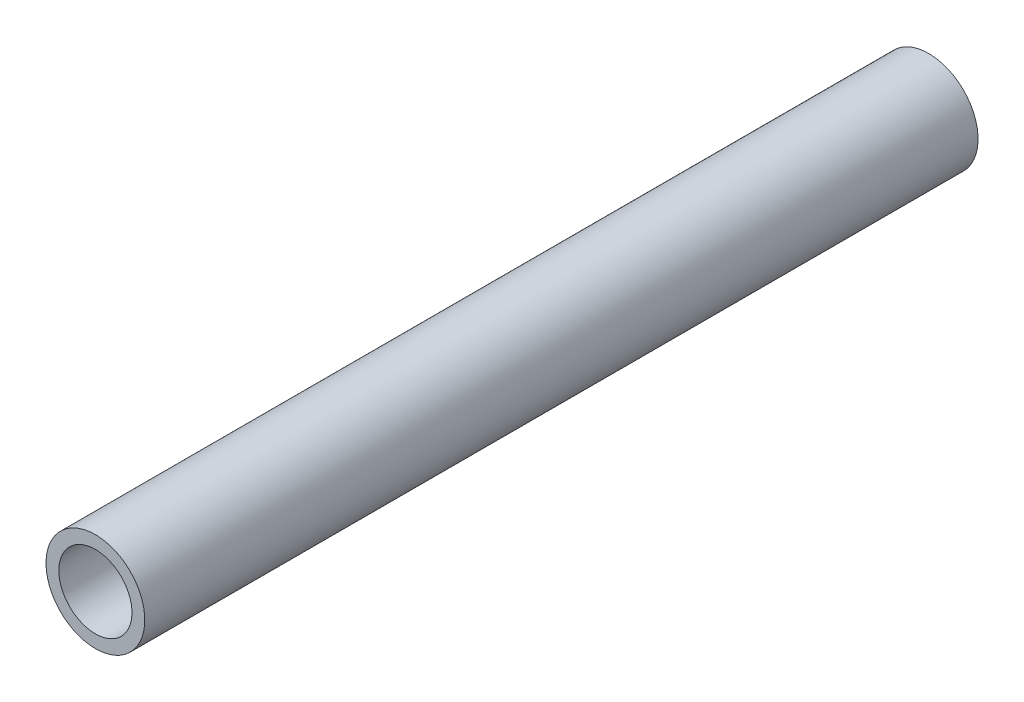
ISO-10303-21;
HEADER;
FILE_DESCRIPTION(('STEP AP214'),'2;1');
FILE_NAME('part.step','',(''),(''),'','','');
FILE_SCHEMA(('AUTOMOTIVE_DESIGN { 1 0 10303 214 1 1 1 1 }'));
ENDSEC;
DATA;
#1=APPLICATION_CONTEXT('core data for automotive mechanical design processes');
#2=APPLICATION_PROTOCOL_DEFINITION('international standard','automotive_design',2000,#1);
#3=PRODUCT_CONTEXT('',#1,'mechanical');
#4=PRODUCT('Part','Part','',(#3));
#5=PRODUCT_RELATED_PRODUCT_CATEGORY('part','',(#4));
#6=PRODUCT_DEFINITION_FORMATION('','',#4);
#7=PRODUCT_DEFINITION_CONTEXT('part definition',#1,'design');
#8=PRODUCT_DEFINITION('design','',#6,#7);
#9=PRODUCT_DEFINITION_SHAPE('','',#8);
#10=(LENGTH_UNIT() NAMED_UNIT(*) SI_UNIT(.MILLI.,.METRE.));
#11=(NAMED_UNIT(*) PLANE_ANGLE_UNIT() SI_UNIT($,.RADIAN.));
#12=(NAMED_UNIT(*) SI_UNIT($,.STERADIAN.) SOLID_ANGLE_UNIT());
#13=UNCERTAINTY_MEASURE_WITH_UNIT(LENGTH_MEASURE(1.E-05),#10,'distance_accuracy_value','');
#14=(GEOMETRIC_REPRESENTATION_CONTEXT(3) GLOBAL_UNCERTAINTY_ASSIGNED_CONTEXT((#13)) GLOBAL_UNIT_ASSIGNED_CONTEXT((#10,
#11,#12)) REPRESENTATION_CONTEXT('',''));
#15=CARTESIAN_POINT('',(0.,0.,0.));
#16=DIRECTION('',(0.,0.,1.));
#17=DIRECTION('',(1.,0.,0.));
#18=AXIS2_PLACEMENT_3D('',#15,#16,#17);
#19=CARTESIAN_POINT('',(0.,0.,90.));
#20=DIRECTION('',(0.,0.,1.));
#21=DIRECTION('',(1.,0.,0.));
#22=AXIS2_PLACEMENT_3D('',#19,#20,#21);
#23=PLANE('',#22);
#24=CARTESIAN_POINT('',(0.,0.,90.));
#25=DIRECTION('',(0.,0.,1.));
#26=DIRECTION('',(1.,0.,0.));
#27=AXIS2_PLACEMENT_3D('',#24,#25,#26);
#28=CIRCLE('',#27,10.668);
#29=CARTESIAN_POINT('',(-10.668,0.,90.));
#30=VERTEX_POINT('',#29);
#31=EDGE_CURVE('E11',#30,#30,#28,.T.);
#32=ORIENTED_EDGE('',*,*,#31,.T.);
#33=EDGE_LOOP('',(#32));
#34=FACE_BOUND('',#33,.T.);
#35=CARTESIAN_POINT('',(0.,0.,90.));
#36=DIRECTION('',(0.,0.,1.));
#37=DIRECTION('',(1.,0.,0.));
#38=AXIS2_PLACEMENT_3D('',#35,#36,#37);
#39=CIRCLE('',#38,7.8994);
#40=CARTESIAN_POINT('',(-7.8994,0.,90.));
#41=VERTEX_POINT('',#40);
#42=EDGE_CURVE('E47',#41,#41,#39,.T.);
#43=ORIENTED_EDGE('',*,*,#42,.F.);
#44=EDGE_LOOP('',(#43));
#45=FACE_BOUND('',#44,.T.);
#46=ADVANCED_FACE('F36',(#34,#45),#23,.T.);
#47=CARTESIAN_POINT('',(0.,0.,-90.));
#48=DIRECTION('',(0.,0.,1.));
#49=DIRECTION('',(1.,0.,0.));
#50=AXIS2_PLACEMENT_3D('',#47,#48,#49);
#51=PLANE('',#50);
#52=CARTESIAN_POINT('',(0.,0.,-90.));
#53=DIRECTION('',(0.,0.,1.));
#54=DIRECTION('',(1.,0.,0.));
#55=AXIS2_PLACEMENT_3D('',#52,#53,#54);
#56=CIRCLE('',#55,10.668);
#57=CARTESIAN_POINT('',(-10.668,0.,-90.));
#58=VERTEX_POINT('',#57);
#59=EDGE_CURVE('E40',#58,#58,#56,.T.);
#60=ORIENTED_EDGE('',*,*,#59,.F.);
#61=EDGE_LOOP('',(#60));
#62=FACE_BOUND('',#61,.T.);
#63=CARTESIAN_POINT('',(0.,0.,-90.));
#64=DIRECTION('',(0.,0.,1.));
#65=DIRECTION('',(1.,0.,0.));
#66=AXIS2_PLACEMENT_3D('',#63,#64,#65);
#67=CIRCLE('',#66,7.8994);
#68=CARTESIAN_POINT('',(-7.8994,0.,-90.));
#69=VERTEX_POINT('',#68);
#70=EDGE_CURVE('E49',#69,#69,#67,.T.);
#71=ORIENTED_EDGE('',*,*,#70,.T.);
#72=EDGE_LOOP('',(#71));
#73=FACE_BOUND('',#72,.T.);
#74=ADVANCED_FACE('F59',(#62,#73),#51,.F.);
#75=CARTESIAN_POINT('',(0.,0.,90.));
#76=DIRECTION('',(0.,0.,-1.));
#77=DIRECTION('',(-1.,0.,0.));
#78=AXIS2_PLACEMENT_3D('',#75,#76,#77);
#79=CYLINDRICAL_SURFACE('',#78,10.668);
#80=CARTESIAN_POINT('',(-10.668,0.,90.));
#81=CARTESIAN_POINT('',(-10.668,0.,88.125));
#82=CARTESIAN_POINT('',(-10.668,0.,86.25));
#83=CARTESIAN_POINT('',(-10.668,0.,82.5));
#84=CARTESIAN_POINT('',(-10.668,0.,80.625));
#85=CARTESIAN_POINT('',(-10.668,0.,76.875));
#86=CARTESIAN_POINT('',(-10.668,0.,75.));
#87=CARTESIAN_POINT('',(-10.668,0.,71.25));
#88=CARTESIAN_POINT('',(-10.668,0.,69.375));
#89=CARTESIAN_POINT('',(-10.668,0.,65.625));
#90=CARTESIAN_POINT('',(-10.668,0.,63.75));
#91=CARTESIAN_POINT('',(-10.668,0.,60.));
#92=CARTESIAN_POINT('',(-10.668,0.,58.125));
#93=CARTESIAN_POINT('',(-10.668,0.,54.375));
#94=CARTESIAN_POINT('',(-10.668,0.,52.5));
#95=CARTESIAN_POINT('',(-10.668,0.,48.75));
#96=CARTESIAN_POINT('',(-10.668,0.,46.875));
#97=CARTESIAN_POINT('',(-10.668,0.,43.125));
#98=CARTESIAN_POINT('',(-10.668,0.,41.25));
#99=CARTESIAN_POINT('',(-10.668,0.,37.5));
#100=CARTESIAN_POINT('',(-10.668,0.,35.625));
#101=CARTESIAN_POINT('',(-10.668,0.,31.875));
#102=CARTESIAN_POINT('',(-10.668,0.,30.));
#103=CARTESIAN_POINT('',(-10.668,0.,26.25));
#104=CARTESIAN_POINT('',(-10.668,0.,24.375));
#105=CARTESIAN_POINT('',(-10.668,0.,20.625));
#106=CARTESIAN_POINT('',(-10.668,0.,18.75));
#107=CARTESIAN_POINT('',(-10.668,0.,15.));
#108=CARTESIAN_POINT('',(-10.668,0.,13.125));
#109=CARTESIAN_POINT('',(-10.668,0.,9.37499999999998));
#110=CARTESIAN_POINT('',(-10.668,0.,7.49999999999998));
#111=CARTESIAN_POINT('',(-10.668,0.,3.74999999999998));
#112=CARTESIAN_POINT('',(-10.668,0.,1.87499999999997));
#113=CARTESIAN_POINT('',(-10.668,0.,-1.87500000000003));
#114=CARTESIAN_POINT('',(-10.668,0.,-3.75000000000003));
#115=CARTESIAN_POINT('',(-10.668,0.,-7.50000000000003));
#116=CARTESIAN_POINT('',(-10.668,0.,-9.37500000000004));
#117=CARTESIAN_POINT('',(-10.668,0.,-13.125));
#118=CARTESIAN_POINT('',(-10.668,0.,-15.));
#119=CARTESIAN_POINT('',(-10.668,0.,-18.75));
#120=CARTESIAN_POINT('',(-10.668,0.,-20.625));
#121=CARTESIAN_POINT('',(-10.668,0.,-24.375));
#122=CARTESIAN_POINT('',(-10.668,0.,-26.25));
#123=CARTESIAN_POINT('',(-10.668,0.,-30.));
#124=CARTESIAN_POINT('',(-10.668,0.,-31.875));
#125=CARTESIAN_POINT('',(-10.668,0.,-35.625));
#126=CARTESIAN_POINT('',(-10.668,0.,-37.5));
#127=CARTESIAN_POINT('',(-10.668,0.,-41.25));
#128=CARTESIAN_POINT('',(-10.668,0.,-43.125));
#129=CARTESIAN_POINT('',(-10.668,0.,-46.875));
#130=CARTESIAN_POINT('',(-10.668,0.,-48.75));
#131=CARTESIAN_POINT('',(-10.668,0.,-52.5));
#132=CARTESIAN_POINT('',(-10.668,0.,-54.375));
#133=CARTESIAN_POINT('',(-10.668,0.,-58.125));
#134=CARTESIAN_POINT('',(-10.668,0.,-60.));
#135=CARTESIAN_POINT('',(-10.668,0.,-63.75));
#136=CARTESIAN_POINT('',(-10.668,0.,-65.625));
#137=CARTESIAN_POINT('',(-10.668,0.,-69.375));
#138=CARTESIAN_POINT('',(-10.668,0.,-71.25));
#139=CARTESIAN_POINT('',(-10.668,0.,-75.));
#140=CARTESIAN_POINT('',(-10.668,0.,-76.875));
#141=CARTESIAN_POINT('',(-10.668,0.,-80.625));
#142=CARTESIAN_POINT('',(-10.668,0.,-82.5));
#143=CARTESIAN_POINT('',(-10.668,0.,-86.25));
#144=CARTESIAN_POINT('',(-10.668,0.,-88.125));
#145=CARTESIAN_POINT('',(-10.668,0.,-90.));
#146=B_SPLINE_CURVE_WITH_KNOTS('',3,(#80,#81,#82,#83,#84,#85,#86,#87,#88,#89,#90,#91,#92,#93,
#94,#95,#96,#97,#98,#99,#100,#101,#102,#103,#104,#105,#106,#107,#108,#109,#110,#111,#112,#113,
#114,#115,#116,#117,#118,#119,#120,#121,#122,#123,#124,#125,#126,#127,#128,#129,#130,#131,#132,
#133,#134,#135,#136,#137,#138,#139,#140,#141,#142,#143,#144,#145),.UNSPECIFIED.,.F.,.F.,(4,2,2,
2,2,2,2,2,2,2,2,2,2,2,2,2,2,2,2,2,2,2,2,2,2,2,2,2,2,2,2,2,4),(0.,5.62499999999999,11.25,16.875,
22.5,28.125,33.75,39.375,45.,50.625,56.25,61.875,67.5,73.125,78.75,84.375,90.,95.625,101.25,
106.875,112.5,118.125,123.75,129.375,135.,140.625,146.25,151.875,157.5,163.125,168.75,174.375,
180.),.UNSPECIFIED.);
#147=EDGE_CURVE('BSEAM38',#30,#58,#146,.T.);
#148=ORIENTED_EDGE('',*,*,#31,.F.);
#149=ORIENTED_EDGE('',*,*,#59,.T.);
#150=ORIENTED_EDGE('',*,*,#147,.T.);
#151=ORIENTED_EDGE('',*,*,#147,.F.);
#152=EDGE_LOOP('',(#148,#150,#149,#151));
#153=FACE_BOUND('',#152,.T.);
#154=ADVANCED_FACE('F38',(#153),#79,.T.);
#155=CARTESIAN_POINT('',(0.,0.,90.));
#156=DIRECTION('',(0.,0.,-1.));
#157=DIRECTION('',(-1.,0.,0.));
#158=AXIS2_PLACEMENT_3D('',#155,#156,#157);
#159=CYLINDRICAL_SURFACE('',#158,7.8994);
#160=CARTESIAN_POINT('',(-7.8994,0.,90.));
#161=CARTESIAN_POINT('',(-7.8994,0.,88.125));
#162=CARTESIAN_POINT('',(-7.8994,0.,86.25));
#163=CARTESIAN_POINT('',(-7.8994,0.,82.5));
#164=CARTESIAN_POINT('',(-7.8994,0.,80.625));
#165=CARTESIAN_POINT('',(-7.8994,0.,76.875));
#166=CARTESIAN_POINT('',(-7.8994,0.,75.));
#167=CARTESIAN_POINT('',(-7.8994,0.,71.25));
#168=CARTESIAN_POINT('',(-7.8994,0.,69.375));
#169=CARTESIAN_POINT('',(-7.8994,0.,65.625));
#170=CARTESIAN_POINT('',(-7.8994,0.,63.75));
#171=CARTESIAN_POINT('',(-7.8994,0.,60.));
#172=CARTESIAN_POINT('',(-7.8994,0.,58.125));
#173=CARTESIAN_POINT('',(-7.8994,0.,54.375));
#174=CARTESIAN_POINT('',(-7.8994,0.,52.5));
#175=CARTESIAN_POINT('',(-7.8994,0.,48.75));
#176=CARTESIAN_POINT('',(-7.8994,0.,46.875));
#177=CARTESIAN_POINT('',(-7.8994,0.,43.125));
#178=CARTESIAN_POINT('',(-7.8994,0.,41.25));
#179=CARTESIAN_POINT('',(-7.8994,0.,37.5));
#180=CARTESIAN_POINT('',(-7.8994,0.,35.625));
#181=CARTESIAN_POINT('',(-7.8994,0.,31.875));
#182=CARTESIAN_POINT('',(-7.8994,0.,30.));
#183=CARTESIAN_POINT('',(-7.8994,0.,26.25));
#184=CARTESIAN_POINT('',(-7.8994,0.,24.375));
#185=CARTESIAN_POINT('',(-7.8994,0.,20.625));
#186=CARTESIAN_POINT('',(-7.8994,0.,18.75));
#187=CARTESIAN_POINT('',(-7.8994,0.,15.));
#188=CARTESIAN_POINT('',(-7.8994,0.,13.125));
#189=CARTESIAN_POINT('',(-7.8994,0.,9.37499999999999));
#190=CARTESIAN_POINT('',(-7.8994,0.,7.49999999999999));
#191=CARTESIAN_POINT('',(-7.8994,0.,3.74999999999999));
#192=CARTESIAN_POINT('',(-7.8994,0.,1.87499999999999));
#193=CARTESIAN_POINT('',(-7.8994,0.,-1.87500000000002));
#194=CARTESIAN_POINT('',(-7.8994,0.,-3.75000000000002));
#195=CARTESIAN_POINT('',(-7.8994,0.,-7.50000000000002));
#196=CARTESIAN_POINT('',(-7.8994,0.,-9.37500000000002));
#197=CARTESIAN_POINT('',(-7.8994,0.,-13.125));
#198=CARTESIAN_POINT('',(-7.8994,0.,-15.));
#199=CARTESIAN_POINT('',(-7.8994,0.,-18.75));
#200=CARTESIAN_POINT('',(-7.8994,0.,-20.625));
#201=CARTESIAN_POINT('',(-7.8994,0.,-24.375));
#202=CARTESIAN_POINT('',(-7.8994,0.,-26.25));
#203=CARTESIAN_POINT('',(-7.8994,0.,-30.));
#204=CARTESIAN_POINT('',(-7.8994,0.,-31.875));
#205=CARTESIAN_POINT('',(-7.8994,0.,-35.625));
#206=CARTESIAN_POINT('',(-7.8994,0.,-37.5));
#207=CARTESIAN_POINT('',(-7.8994,0.,-41.25));
#208=CARTESIAN_POINT('',(-7.8994,0.,-43.125));
#209=CARTESIAN_POINT('',(-7.8994,0.,-46.875));
#210=CARTESIAN_POINT('',(-7.8994,0.,-48.75));
#211=CARTESIAN_POINT('',(-7.8994,0.,-52.5));
#212=CARTESIAN_POINT('',(-7.8994,0.,-54.375));
#213=CARTESIAN_POINT('',(-7.8994,0.,-58.125));
#214=CARTESIAN_POINT('',(-7.8994,0.,-60.));
#215=CARTESIAN_POINT('',(-7.8994,0.,-63.75));
#216=CARTESIAN_POINT('',(-7.8994,0.,-65.625));
#217=CARTESIAN_POINT('',(-7.8994,0.,-69.375));
#218=CARTESIAN_POINT('',(-7.8994,0.,-71.25));
#219=CARTESIAN_POINT('',(-7.8994,0.,-75.));
#220=CARTESIAN_POINT('',(-7.8994,0.,-76.875));
#221=CARTESIAN_POINT('',(-7.8994,0.,-80.625));
#222=CARTESIAN_POINT('',(-7.8994,0.,-82.5));
#223=CARTESIAN_POINT('',(-7.8994,0.,-86.25));
#224=CARTESIAN_POINT('',(-7.8994,0.,-88.125));
#225=CARTESIAN_POINT('',(-7.8994,0.,-90.));
#226=B_SPLINE_CURVE_WITH_KNOTS('',3,(#160,#161,#162,#163,#164,#165,#166,#167,#168,#169,#170,
#171,#172,#173,#174,#175,#176,#177,#178,#179,#180,#181,#182,#183,#184,#185,#186,#187,#188,#189,
#190,#191,#192,#193,#194,#195,#196,#197,#198,#199,#200,#201,#202,#203,#204,#205,#206,#207,#208,
#209,#210,#211,#212,#213,#214,#215,#216,#217,#218,#219,#220,#221,#222,#223,#224,#225),
.UNSPECIFIED.,.F.,.F.,(4,2,2,2,2,2,2,2,2,2,2,2,2,2,2,2,2,2,2,2,2,2,2,2,2,2,2,2,2,2,2,2,4),(0.,
5.62500000000001,11.25,16.875,22.5,28.125,33.75,39.375,45.,50.625,56.25,61.875,67.5,73.125,
78.75,84.375,90.,95.625,101.25,106.875,112.5,118.125,123.75,129.375,135.,140.625,146.25,151.875,
157.5,163.125,168.75,174.375,180.),.UNSPECIFIED.);
#227=EDGE_CURVE('BSEAM55',#41,#69,#226,.T.);
#228=ORIENTED_EDGE('',*,*,#42,.T.);
#229=ORIENTED_EDGE('',*,*,#70,.F.);
#230=ORIENTED_EDGE('',*,*,#227,.T.);
#231=ORIENTED_EDGE('',*,*,#227,.F.);
#232=EDGE_LOOP('',(#228,#230,#229,#231));
#233=FACE_BOUND('',#232,.T.);
#234=ADVANCED_FACE('F55',(#233),#159,.F.);
#235=CLOSED_SHELL('',(#46,#74,#154,#234));
#236=MANIFOLD_SOLID_BREP('B2',#235);
#237=ADVANCED_BREP_SHAPE_REPRESENTATION('',(#18,#236),#14);
#238=SHAPE_DEFINITION_REPRESENTATION(#9,#237);
ENDSEC;
END-ISO-10303-21;
